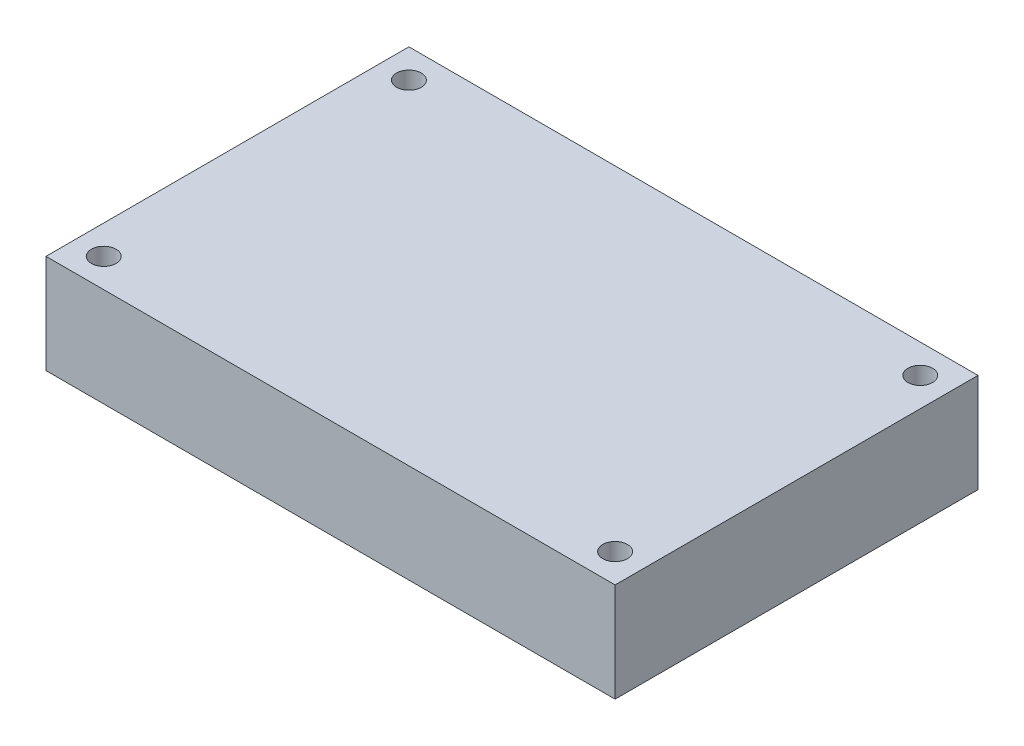
ISO-10303-21;
HEADER;
FILE_DESCRIPTION(('STEP AP214'),'2;1');
FILE_NAME('part.step','',(''),(''),'','','');
FILE_SCHEMA(('AUTOMOTIVE_DESIGN { 1 0 10303 214 1 1 1 1 }'));
ENDSEC;
DATA;
#1=APPLICATION_CONTEXT('core data for automotive mechanical design processes');
#2=APPLICATION_PROTOCOL_DEFINITION('international standard','automotive_design',2000,#1);
#3=PRODUCT_CONTEXT('',#1,'mechanical');
#4=PRODUCT('Part','Part','',(#3));
#5=PRODUCT_RELATED_PRODUCT_CATEGORY('part','',(#4));
#6=PRODUCT_DEFINITION_FORMATION('','',#4);
#7=PRODUCT_DEFINITION_CONTEXT('part definition',#1,'design');
#8=PRODUCT_DEFINITION('design','',#6,#7);
#9=PRODUCT_DEFINITION_SHAPE('','',#8);
#10=(LENGTH_UNIT() NAMED_UNIT(*) SI_UNIT(.MILLI.,.METRE.));
#11=(NAMED_UNIT(*) PLANE_ANGLE_UNIT() SI_UNIT($,.RADIAN.));
#12=(NAMED_UNIT(*) SI_UNIT($,.STERADIAN.) SOLID_ANGLE_UNIT());
#13=UNCERTAINTY_MEASURE_WITH_UNIT(LENGTH_MEASURE(1.E-05),#10,'distance_accuracy_value','');
#14=(GEOMETRIC_REPRESENTATION_CONTEXT(3) GLOBAL_UNCERTAINTY_ASSIGNED_CONTEXT((#13)) GLOBAL_UNIT_ASSIGNED_CONTEXT((#10,
#11,#12)) REPRESENTATION_CONTEXT('',''));
#15=CARTESIAN_POINT('',(0.,0.,0.));
#16=DIRECTION('',(0.,0.,1.));
#17=DIRECTION('',(1.,0.,0.));
#18=AXIS2_PLACEMENT_3D('',#15,#16,#17);
#19=CARTESIAN_POINT('',(34.5,12.,-22.));
#20=DIRECTION('',(-1.,0.,0.));
#21=DIRECTION('',(0.,0.,1.));
#22=AXIS2_PLACEMENT_3D('',#19,#20,#21);
#23=PLANE('',#22);
#24=DIRECTION('',(0.,0.,-1.));
#25=VECTOR('',#24,1.);
#26=CARTESIAN_POINT('',(34.5,0.,-22.));
#27=LINE('',#26,#25);
#28=CARTESIAN_POINT('',(34.5,0.,22.));
#29=VERTEX_POINT('',#28);
#30=CARTESIAN_POINT('',(34.5,0.,-22.));
#31=VERTEX_POINT('',#30);
#32=EDGE_CURVE('E104',#29,#31,#27,.T.);
#33=ORIENTED_EDGE('',*,*,#32,.T.);
#34=DIRECTION('',(0.,-1.,0.));
#35=VECTOR('',#34,1.);
#36=CARTESIAN_POINT('',(34.5,12.,-22.));
#37=LINE('',#36,#35);
#38=CARTESIAN_POINT('',(34.5,12.,-22.));
#39=VERTEX_POINT('',#38);
#40=EDGE_CURVE('E11',#39,#31,#37,.T.);
#41=ORIENTED_EDGE('',*,*,#40,.F.);
#42=DIRECTION('',(0.,0.,-1.));
#43=VECTOR('',#42,1.);
#44=CARTESIAN_POINT('',(34.5,12.,-22.));
#45=LINE('',#44,#43);
#46=CARTESIAN_POINT('',(34.5,12.,22.));
#47=VERTEX_POINT('',#46);
#48=EDGE_CURVE('E92',#47,#39,#45,.T.);
#49=ORIENTED_EDGE('',*,*,#48,.F.);
#50=DIRECTION('',(0.,-1.,0.));
#51=VECTOR('',#50,1.);
#52=CARTESIAN_POINT('',(34.5,12.,22.));
#53=LINE('',#52,#51);
#54=EDGE_CURVE('E100',#47,#29,#53,.T.);
#55=ORIENTED_EDGE('',*,*,#54,.T.);
#56=EDGE_LOOP('',(#33,#41,#49,#55));
#57=FACE_BOUND('',#56,.T.);
#58=ADVANCED_FACE('F41',(#57),#23,.F.);
#59=CARTESIAN_POINT('',(-34.5,12.,-22.));
#60=DIRECTION('',(0.,0.,1.));
#61=DIRECTION('',(1.,0.,0.));
#62=AXIS2_PLACEMENT_3D('',#59,#60,#61);
#63=PLANE('',#62);
#64=DIRECTION('',(-1.,0.,0.));
#65=VECTOR('',#64,1.);
#66=CARTESIAN_POINT('',(-34.5,0.,-22.));
#67=LINE('',#66,#65);
#68=CARTESIAN_POINT('',(-34.5,0.,-22.));
#69=VERTEX_POINT('',#68);
#70=EDGE_CURVE('E96',#31,#69,#67,.T.);
#71=ORIENTED_EDGE('',*,*,#70,.T.);
#72=DIRECTION('',(0.,-1.,0.));
#73=VECTOR('',#72,1.);
#74=CARTESIAN_POINT('',(-34.5,12.,-22.));
#75=LINE('',#74,#73);
#76=CARTESIAN_POINT('',(-34.5,12.,-22.));
#77=VERTEX_POINT('',#76);
#78=EDGE_CURVE('E49',#77,#69,#75,.T.);
#79=ORIENTED_EDGE('',*,*,#78,.F.);
#80=DIRECTION('',(-1.,0.,0.));
#81=VECTOR('',#80,1.);
#82=CARTESIAN_POINT('',(-34.5,12.,-22.));
#83=LINE('',#82,#81);
#84=EDGE_CURVE('E87',#39,#77,#83,.T.);
#85=ORIENTED_EDGE('',*,*,#84,.F.);
#86=ORIENTED_EDGE('',*,*,#40,.T.);
#87=EDGE_LOOP('',(#71,#79,#85,#86));
#88=FACE_BOUND('',#87,.T.);
#89=ADVANCED_FACE('F95',(#88),#63,.F.);
#90=CARTESIAN_POINT('',(-34.5,12.,-22.));
#91=DIRECTION('',(1.,0.,0.));
#92=DIRECTION('',(0.,0.,-1.));
#93=AXIS2_PLACEMENT_3D('',#90,#91,#92);
#94=PLANE('',#93);
#95=DIRECTION('',(0.,0.,1.));
#96=VECTOR('',#95,1.);
#97=CARTESIAN_POINT('',(-34.5,0.,-22.));
#98=LINE('',#97,#96);
#99=CARTESIAN_POINT('',(-34.5,0.,22.));
#100=VERTEX_POINT('',#99);
#101=EDGE_CURVE('E74',#69,#100,#98,.T.);
#102=ORIENTED_EDGE('',*,*,#101,.T.);
#103=DIRECTION('',(0.,-1.,0.));
#104=VECTOR('',#103,1.);
#105=CARTESIAN_POINT('',(-34.5,12.,22.));
#106=LINE('',#105,#104);
#107=CARTESIAN_POINT('',(-34.5,12.,22.));
#108=VERTEX_POINT('',#107);
#109=EDGE_CURVE('E97',#108,#100,#106,.T.);
#110=ORIENTED_EDGE('',*,*,#109,.F.);
#111=DIRECTION('',(0.,0.,1.));
#112=VECTOR('',#111,1.);
#113=CARTESIAN_POINT('',(-34.5,12.,-22.));
#114=LINE('',#113,#112);
#115=EDGE_CURVE('E90',#77,#108,#114,.T.);
#116=ORIENTED_EDGE('',*,*,#115,.F.);
#117=ORIENTED_EDGE('',*,*,#78,.T.);
#118=EDGE_LOOP('',(#102,#110,#116,#117));
#119=FACE_BOUND('',#118,.T.);
#120=ADVANCED_FACE('F98',(#119),#94,.F.);
#121=CARTESIAN_POINT('',(-34.5,12.,22.));
#122=DIRECTION('',(0.,0.,-1.));
#123=DIRECTION('',(-1.,0.,0.));
#124=AXIS2_PLACEMENT_3D('',#121,#122,#123);
#125=PLANE('',#124);
#126=DIRECTION('',(1.,0.,0.));
#127=VECTOR('',#126,1.);
#128=CARTESIAN_POINT('',(-34.5,0.,22.));
#129=LINE('',#128,#127);
#130=EDGE_CURVE('E80',#100,#29,#129,.T.);
#131=ORIENTED_EDGE('',*,*,#130,.T.);
#132=ORIENTED_EDGE('',*,*,#54,.F.);
#133=DIRECTION('',(1.,0.,0.));
#134=VECTOR('',#133,1.);
#135=CARTESIAN_POINT('',(-34.5,12.,22.));
#136=LINE('',#135,#134);
#137=EDGE_CURVE('E57',#108,#47,#136,.T.);
#138=ORIENTED_EDGE('',*,*,#137,.F.);
#139=ORIENTED_EDGE('',*,*,#109,.T.);
#140=EDGE_LOOP('',(#131,#132,#138,#139));
#141=FACE_BOUND('',#140,.T.);
#142=ADVANCED_FACE('F112',(#141),#125,.F.);
#143=CARTESIAN_POINT('',(0.,12.,0.));
#144=DIRECTION('',(0.,1.,0.));
#145=DIRECTION('',(0.,0.,1.));
#146=AXIS2_PLACEMENT_3D('',#143,#144,#145);
#147=PLANE('',#146);
#148=CARTESIAN_POINT('',(31.,12.,-18.5));
#149=DIRECTION('',(0.,1.,0.));
#150=DIRECTION('',(0.,0.,-1.));
#151=AXIS2_PLACEMENT_3D('',#148,#149,#150);
#152=CIRCLE('',#151,1.5);
#153=CARTESIAN_POINT('',(31.,12.,-20.));
#154=VERTEX_POINT('',#153);
#155=EDGE_CURVE('E127',#154,#154,#152,.T.);
#156=ORIENTED_EDGE('',*,*,#155,.F.);
#157=EDGE_LOOP('',(#156));
#158=FACE_BOUND('',#157,.T.);
#159=CARTESIAN_POINT('',(31.,12.,18.5));
#160=DIRECTION('',(0.,1.,0.));
#161=DIRECTION('',(0.,0.,1.));
#162=AXIS2_PLACEMENT_3D('',#159,#160,#161);
#163=CIRCLE('',#162,1.5);
#164=CARTESIAN_POINT('',(31.,12.,20.));
#165=VERTEX_POINT('',#164);
#166=EDGE_CURVE('E133',#165,#165,#163,.T.);
#167=ORIENTED_EDGE('',*,*,#166,.F.);
#168=EDGE_LOOP('',(#167));
#169=FACE_BOUND('',#168,.T.);
#170=CARTESIAN_POINT('',(-31.,12.,18.5));
#171=DIRECTION('',(0.,1.,0.));
#172=DIRECTION('',(0.,0.,-1.));
#173=AXIS2_PLACEMENT_3D('',#170,#171,#172);
#174=CIRCLE('',#173,1.5);
#175=CARTESIAN_POINT('',(-31.,12.,17.));
#176=VERTEX_POINT('',#175);
#177=EDGE_CURVE('E121',#176,#176,#174,.T.);
#178=ORIENTED_EDGE('',*,*,#177,.F.);
#179=EDGE_LOOP('',(#178));
#180=FACE_BOUND('',#179,.T.);
#181=CARTESIAN_POINT('',(-31.,12.,-18.5));
#182=DIRECTION('',(0.,1.,0.));
#183=DIRECTION('',(0.,0.,1.));
#184=AXIS2_PLACEMENT_3D('',#181,#182,#183);
#185=CIRCLE('',#184,1.5);
#186=CARTESIAN_POINT('',(-31.,12.,-17.));
#187=VERTEX_POINT('',#186);
#188=EDGE_CURVE('E118',#187,#187,#185,.T.);
#189=ORIENTED_EDGE('',*,*,#188,.F.);
#190=EDGE_LOOP('',(#189));
#191=FACE_BOUND('',#190,.T.);
#192=ORIENTED_EDGE('',*,*,#48,.T.);
#193=ORIENTED_EDGE('',*,*,#84,.T.);
#194=ORIENTED_EDGE('',*,*,#115,.T.);
#195=ORIENTED_EDGE('',*,*,#137,.T.);
#196=EDGE_LOOP('',(#192,#193,#194,#195));
#197=FACE_BOUND('',#196,.T.);
#198=ADVANCED_FACE('F88',(#158,#169,#180,#191,#197),#147,.T.);
#199=CARTESIAN_POINT('',(0.,0.,0.));
#200=DIRECTION('',(0.,1.,0.));
#201=DIRECTION('',(0.,0.,1.));
#202=AXIS2_PLACEMENT_3D('',#199,#200,#201);
#203=PLANE('',#202);
#204=CARTESIAN_POINT('',(31.,0.,-18.5));
#205=DIRECTION('',(0.,1.,0.));
#206=DIRECTION('',(0.,0.,-1.));
#207=AXIS2_PLACEMENT_3D('',#204,#205,#206);
#208=CIRCLE('',#207,1.5);
#209=CARTESIAN_POINT('',(31.,0.,-20.));
#210=VERTEX_POINT('',#209);
#211=EDGE_CURVE('E124',#210,#210,#208,.T.);
#212=ORIENTED_EDGE('',*,*,#211,.T.);
#213=EDGE_LOOP('',(#212));
#214=FACE_BOUND('',#213,.T.);
#215=CARTESIAN_POINT('',(31.,0.,18.5));
#216=DIRECTION('',(0.,1.,0.));
#217=DIRECTION('',(0.,0.,1.));
#218=AXIS2_PLACEMENT_3D('',#215,#216,#217);
#219=CIRCLE('',#218,1.5);
#220=CARTESIAN_POINT('',(31.,0.,20.));
#221=VERTEX_POINT('',#220);
#222=EDGE_CURVE('E130',#221,#221,#219,.T.);
#223=ORIENTED_EDGE('',*,*,#222,.T.);
#224=EDGE_LOOP('',(#223));
#225=FACE_BOUND('',#224,.T.);
#226=CARTESIAN_POINT('',(-31.,0.,18.5));
#227=DIRECTION('',(0.,1.,0.));
#228=DIRECTION('',(0.,0.,-1.));
#229=AXIS2_PLACEMENT_3D('',#226,#227,#228);
#230=CIRCLE('',#229,1.5);
#231=CARTESIAN_POINT('',(-31.,0.,17.));
#232=VERTEX_POINT('',#231);
#233=EDGE_CURVE('E136',#232,#232,#230,.T.);
#234=ORIENTED_EDGE('',*,*,#233,.T.);
#235=EDGE_LOOP('',(#234));
#236=FACE_BOUND('',#235,.T.);
#237=CARTESIAN_POINT('',(-31.,0.,-18.5));
#238=DIRECTION('',(0.,1.,0.));
#239=DIRECTION('',(0.,0.,1.));
#240=AXIS2_PLACEMENT_3D('',#237,#238,#239);
#241=CIRCLE('',#240,1.5);
#242=CARTESIAN_POINT('',(-31.,0.,-17.));
#243=VERTEX_POINT('',#242);
#244=EDGE_CURVE('E107',#243,#243,#241,.T.);
#245=ORIENTED_EDGE('',*,*,#244,.T.);
#246=EDGE_LOOP('',(#245));
#247=FACE_BOUND('',#246,.T.);
#248=ORIENTED_EDGE('',*,*,#32,.F.);
#249=ORIENTED_EDGE('',*,*,#130,.F.);
#250=ORIENTED_EDGE('',*,*,#101,.F.);
#251=ORIENTED_EDGE('',*,*,#70,.F.);
#252=EDGE_LOOP('',(#248,#249,#250,#251));
#253=FACE_BOUND('',#252,.T.);
#254=ADVANCED_FACE('F115',(#214,#225,#236,#247,#253),#203,.F.);
#255=CARTESIAN_POINT('',(-31.,0.,-18.5));
#256=DIRECTION('',(0.,1.,0.));
#257=DIRECTION('',(0.,0.,1.));
#258=AXIS2_PLACEMENT_3D('',#255,#256,#257);
#259=CYLINDRICAL_SURFACE('',#258,1.5);
#260=ORIENTED_EDGE('',*,*,#244,.F.);
#261=EDGE_LOOP('',(#260));
#262=FACE_BOUND('',#261,.T.);
#263=ORIENTED_EDGE('',*,*,#188,.T.);
#264=EDGE_LOOP('',(#263));
#265=FACE_BOUND('',#264,.T.);
#266=ADVANCED_FACE('F150',(#262,#265),#259,.F.);
#267=CARTESIAN_POINT('',(-31.,0.,18.5));
#268=DIRECTION('',(0.,1.,0.));
#269=DIRECTION('',(0.,0.,1.));
#270=AXIS2_PLACEMENT_3D('',#267,#268,#269);
#271=CYLINDRICAL_SURFACE('',#270,1.5);
#272=ORIENTED_EDGE('',*,*,#233,.F.);
#273=EDGE_LOOP('',(#272));
#274=FACE_BOUND('',#273,.T.);
#275=ORIENTED_EDGE('',*,*,#177,.T.);
#276=EDGE_LOOP('',(#275));
#277=FACE_BOUND('',#276,.T.);
#278=ADVANCED_FACE('F142',(#274,#277),#271,.F.);
#279=CARTESIAN_POINT('',(31.,0.,18.5));
#280=DIRECTION('',(0.,1.,0.));
#281=DIRECTION('',(0.,0.,1.));
#282=AXIS2_PLACEMENT_3D('',#279,#280,#281);
#283=CYLINDRICAL_SURFACE('',#282,1.5);
#284=ORIENTED_EDGE('',*,*,#222,.F.);
#285=EDGE_LOOP('',(#284));
#286=FACE_BOUND('',#285,.T.);
#287=ORIENTED_EDGE('',*,*,#166,.T.);
#288=EDGE_LOOP('',(#287));
#289=FACE_BOUND('',#288,.T.);
#290=ADVANCED_FACE('F158',(#286,#289),#283,.F.);
#291=CARTESIAN_POINT('',(31.,0.,-18.5));
#292=DIRECTION('',(0.,1.,0.));
#293=DIRECTION('',(0.,0.,1.));
#294=AXIS2_PLACEMENT_3D('',#291,#292,#293);
#295=CYLINDRICAL_SURFACE('',#294,1.5);
#296=ORIENTED_EDGE('',*,*,#211,.F.);
#297=EDGE_LOOP('',(#296));
#298=FACE_BOUND('',#297,.T.);
#299=ORIENTED_EDGE('',*,*,#155,.T.);
#300=EDGE_LOOP('',(#299));
#301=FACE_BOUND('',#300,.T.);
#302=ADVANCED_FACE('F209',(#298,#301),#295,.F.);
#303=CLOSED_SHELL('',(#58,#89,#120,#142,#198,#254,#266,#278,#290,#302));
#304=MANIFOLD_SOLID_BREP('B2',#303);
#305=ADVANCED_BREP_SHAPE_REPRESENTATION('',(#18,#304),#14);
#306=SHAPE_DEFINITION_REPRESENTATION(#9,#305);
ENDSEC;
END-ISO-10303-21;
